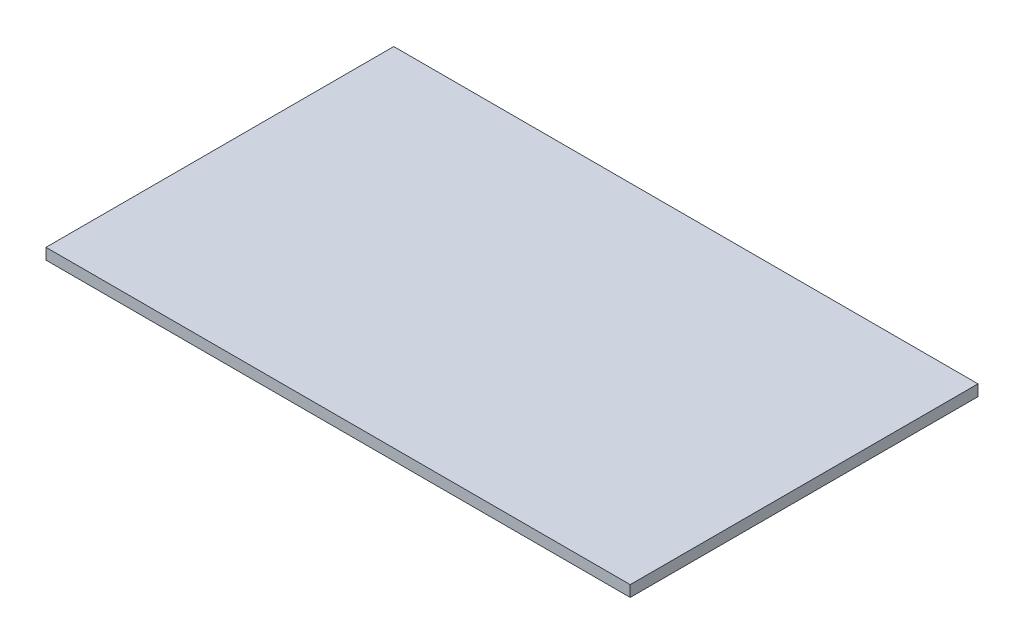
ISO-10303-21;
HEADER;
FILE_DESCRIPTION(('STEP AP214'),'2;1');
FILE_NAME('part.step','',(''),(''),'','','');
FILE_SCHEMA(('AUTOMOTIVE_DESIGN { 1 0 10303 214 1 1 1 1 }'));
ENDSEC;
DATA;
#1=APPLICATION_CONTEXT('core data for automotive mechanical design processes');
#2=APPLICATION_PROTOCOL_DEFINITION('international standard','automotive_design',2000,#1);
#3=PRODUCT_CONTEXT('',#1,'mechanical');
#4=PRODUCT('Part','Part','',(#3));
#5=PRODUCT_RELATED_PRODUCT_CATEGORY('part','',(#4));
#6=PRODUCT_DEFINITION_FORMATION('','',#4);
#7=PRODUCT_DEFINITION_CONTEXT('part definition',#1,'design');
#8=PRODUCT_DEFINITION('design','',#6,#7);
#9=PRODUCT_DEFINITION_SHAPE('','',#8);
#10=(LENGTH_UNIT() NAMED_UNIT(*) SI_UNIT(.MILLI.,.METRE.));
#11=(NAMED_UNIT(*) PLANE_ANGLE_UNIT() SI_UNIT($,.RADIAN.));
#12=(NAMED_UNIT(*) SI_UNIT($,.STERADIAN.) SOLID_ANGLE_UNIT());
#13=UNCERTAINTY_MEASURE_WITH_UNIT(LENGTH_MEASURE(1.E-05),#10,'distance_accuracy_value','');
#14=(GEOMETRIC_REPRESENTATION_CONTEXT(3) GLOBAL_UNCERTAINTY_ASSIGNED_CONTEXT((#13)) GLOBAL_UNIT_ASSIGNED_CONTEXT((#10,
#11,#12)) REPRESENTATION_CONTEXT('',''));
#15=CARTESIAN_POINT('',(0.,0.,0.));
#16=DIRECTION('',(0.,0.,1.));
#17=DIRECTION('',(1.,0.,0.));
#18=AXIS2_PLACEMENT_3D('',#15,#16,#17);
#19=CARTESIAN_POINT('',(0.,8.,0.));
#20=DIRECTION('',(1.,0.,0.));
#21=DIRECTION('',(0.,0.,-1.));
#22=AXIS2_PLACEMENT_3D('',#19,#20,#21);
#23=PLANE('',#22);
#24=DIRECTION('',(0.,0.,1.));
#25=VECTOR('',#24,1.);
#26=CARTESIAN_POINT('',(0.,0.,0.));
#27=LINE('',#26,#25);
#28=CARTESIAN_POINT('',(0.,0.,0.));
#29=VERTEX_POINT('',#28);
#30=CARTESIAN_POINT('',(0.,0.,250.));
#31=VERTEX_POINT('',#30);
#32=EDGE_CURVE('E102',#29,#31,#27,.T.);
#33=ORIENTED_EDGE('',*,*,#32,.T.);
#34=DIRECTION('',(0.,-1.,0.));
#35=VECTOR('',#34,1.);
#36=CARTESIAN_POINT('',(0.,8.,250.));
#37=LINE('',#36,#35);
#38=CARTESIAN_POINT('',(0.,8.,250.));
#39=VERTEX_POINT('',#38);
#40=EDGE_CURVE('E11',#39,#31,#37,.T.);
#41=ORIENTED_EDGE('',*,*,#40,.F.);
#42=DIRECTION('',(0.,0.,1.));
#43=VECTOR('',#42,1.);
#44=CARTESIAN_POINT('',(0.,8.,0.));
#45=LINE('',#44,#43);
#46=CARTESIAN_POINT('',(0.,8.,0.));
#47=VERTEX_POINT('',#46);
#48=EDGE_CURVE('E90',#47,#39,#45,.T.);
#49=ORIENTED_EDGE('',*,*,#48,.F.);
#50=DIRECTION('',(0.,-1.,0.));
#51=VECTOR('',#50,1.);
#52=CARTESIAN_POINT('',(0.,8.,0.));
#53=LINE('',#52,#51);
#54=EDGE_CURVE('E98',#47,#29,#53,.T.);
#55=ORIENTED_EDGE('',*,*,#54,.T.);
#56=EDGE_LOOP('',(#33,#41,#49,#55));
#57=FACE_BOUND('',#56,.T.);
#58=ADVANCED_FACE('F39',(#57),#23,.F.);
#59=CARTESIAN_POINT('',(0.,8.,250.));
#60=DIRECTION('',(0.,0.,-1.));
#61=DIRECTION('',(-1.,0.,0.));
#62=AXIS2_PLACEMENT_3D('',#59,#60,#61);
#63=PLANE('',#62);
#64=DIRECTION('',(1.,0.,0.));
#65=VECTOR('',#64,1.);
#66=CARTESIAN_POINT('',(0.,0.,250.));
#67=LINE('',#66,#65);
#68=CARTESIAN_POINT('',(420.,0.,250.));
#69=VERTEX_POINT('',#68);
#70=EDGE_CURVE('E94',#31,#69,#67,.T.);
#71=ORIENTED_EDGE('',*,*,#70,.T.);
#72=DIRECTION('',(0.,-1.,0.));
#73=VECTOR('',#72,1.);
#74=CARTESIAN_POINT('',(420.,8.,250.));
#75=LINE('',#74,#73);
#76=CARTESIAN_POINT('',(420.,8.,250.));
#77=VERTEX_POINT('',#76);
#78=EDGE_CURVE('E47',#77,#69,#75,.T.);
#79=ORIENTED_EDGE('',*,*,#78,.F.);
#80=DIRECTION('',(1.,0.,0.));
#81=VECTOR('',#80,1.);
#82=CARTESIAN_POINT('',(0.,8.,250.));
#83=LINE('',#82,#81);
#84=EDGE_CURVE('E85',#39,#77,#83,.T.);
#85=ORIENTED_EDGE('',*,*,#84,.F.);
#86=ORIENTED_EDGE('',*,*,#40,.T.);
#87=EDGE_LOOP('',(#71,#79,#85,#86));
#88=FACE_BOUND('',#87,.T.);
#89=ADVANCED_FACE('F93',(#88),#63,.F.);
#90=CARTESIAN_POINT('',(420.,8.,0.));
#91=DIRECTION('',(-1.,0.,0.));
#92=DIRECTION('',(0.,0.,1.));
#93=AXIS2_PLACEMENT_3D('',#90,#91,#92);
#94=PLANE('',#93);
#95=DIRECTION('',(0.,0.,-1.));
#96=VECTOR('',#95,1.);
#97=CARTESIAN_POINT('',(420.,0.,0.));
#98=LINE('',#97,#96);
#99=CARTESIAN_POINT('',(420.,0.,0.));
#100=VERTEX_POINT('',#99);
#101=EDGE_CURVE('E72',#69,#100,#98,.T.);
#102=ORIENTED_EDGE('',*,*,#101,.T.);
#103=DIRECTION('',(0.,-1.,0.));
#104=VECTOR('',#103,1.);
#105=CARTESIAN_POINT('',(420.,8.,0.));
#106=LINE('',#105,#104);
#107=CARTESIAN_POINT('',(420.,8.,0.));
#108=VERTEX_POINT('',#107);
#109=EDGE_CURVE('E95',#108,#100,#106,.T.);
#110=ORIENTED_EDGE('',*,*,#109,.F.);
#111=DIRECTION('',(0.,0.,-1.));
#112=VECTOR('',#111,1.);
#113=CARTESIAN_POINT('',(420.,8.,0.));
#114=LINE('',#113,#112);
#115=EDGE_CURVE('E88',#77,#108,#114,.T.);
#116=ORIENTED_EDGE('',*,*,#115,.F.);
#117=ORIENTED_EDGE('',*,*,#78,.T.);
#118=EDGE_LOOP('',(#102,#110,#116,#117));
#119=FACE_BOUND('',#118,.T.);
#120=ADVANCED_FACE('F96',(#119),#94,.F.);
#121=CARTESIAN_POINT('',(0.,8.,0.));
#122=DIRECTION('',(0.,0.,1.));
#123=DIRECTION('',(1.,0.,0.));
#124=AXIS2_PLACEMENT_3D('',#121,#122,#123);
#125=PLANE('',#124);
#126=DIRECTION('',(-1.,0.,0.));
#127=VECTOR('',#126,1.);
#128=CARTESIAN_POINT('',(0.,0.,0.));
#129=LINE('',#128,#127);
#130=EDGE_CURVE('E78',#100,#29,#129,.T.);
#131=ORIENTED_EDGE('',*,*,#130,.T.);
#132=ORIENTED_EDGE('',*,*,#54,.F.);
#133=DIRECTION('',(-1.,0.,0.));
#134=VECTOR('',#133,1.);
#135=CARTESIAN_POINT('',(0.,8.,0.));
#136=LINE('',#135,#134);
#137=EDGE_CURVE('E55',#108,#47,#136,.T.);
#138=ORIENTED_EDGE('',*,*,#137,.F.);
#139=ORIENTED_EDGE('',*,*,#109,.T.);
#140=EDGE_LOOP('',(#131,#132,#138,#139));
#141=FACE_BOUND('',#140,.T.);
#142=ADVANCED_FACE('F109',(#141),#125,.F.);
#143=CARTESIAN_POINT('',(0.,8.,0.));
#144=DIRECTION('',(0.,1.,0.));
#145=DIRECTION('',(0.,0.,1.));
#146=AXIS2_PLACEMENT_3D('',#143,#144,#145);
#147=PLANE('',#146);
#148=ORIENTED_EDGE('',*,*,#48,.T.);
#149=ORIENTED_EDGE('',*,*,#84,.T.);
#150=ORIENTED_EDGE('',*,*,#115,.T.);
#151=ORIENTED_EDGE('',*,*,#137,.T.);
#152=EDGE_LOOP('',(#148,#149,#150,#151));
#153=FACE_BOUND('',#152,.T.);
#154=ADVANCED_FACE('F86',(#153),#147,.T.);
#155=CARTESIAN_POINT('',(0.,0.,0.));
#156=DIRECTION('',(0.,1.,0.));
#157=DIRECTION('',(0.,0.,1.));
#158=AXIS2_PLACEMENT_3D('',#155,#156,#157);
#159=PLANE('',#158);
#160=ORIENTED_EDGE('',*,*,#32,.F.);
#161=ORIENTED_EDGE('',*,*,#130,.F.);
#162=ORIENTED_EDGE('',*,*,#101,.F.);
#163=ORIENTED_EDGE('',*,*,#70,.F.);
#164=EDGE_LOOP('',(#160,#161,#162,#163));
#165=FACE_BOUND('',#164,.T.);
#166=ADVANCED_FACE('F112',(#165),#159,.F.);
#167=CLOSED_SHELL('',(#58,#89,#120,#142,#154,#166));
#168=MANIFOLD_SOLID_BREP('B2',#167);
#169=ADVANCED_BREP_SHAPE_REPRESENTATION('',(#18,#168),#14);
#170=SHAPE_DEFINITION_REPRESENTATION(#9,#169);
ENDSEC;
END-ISO-10303-21;
